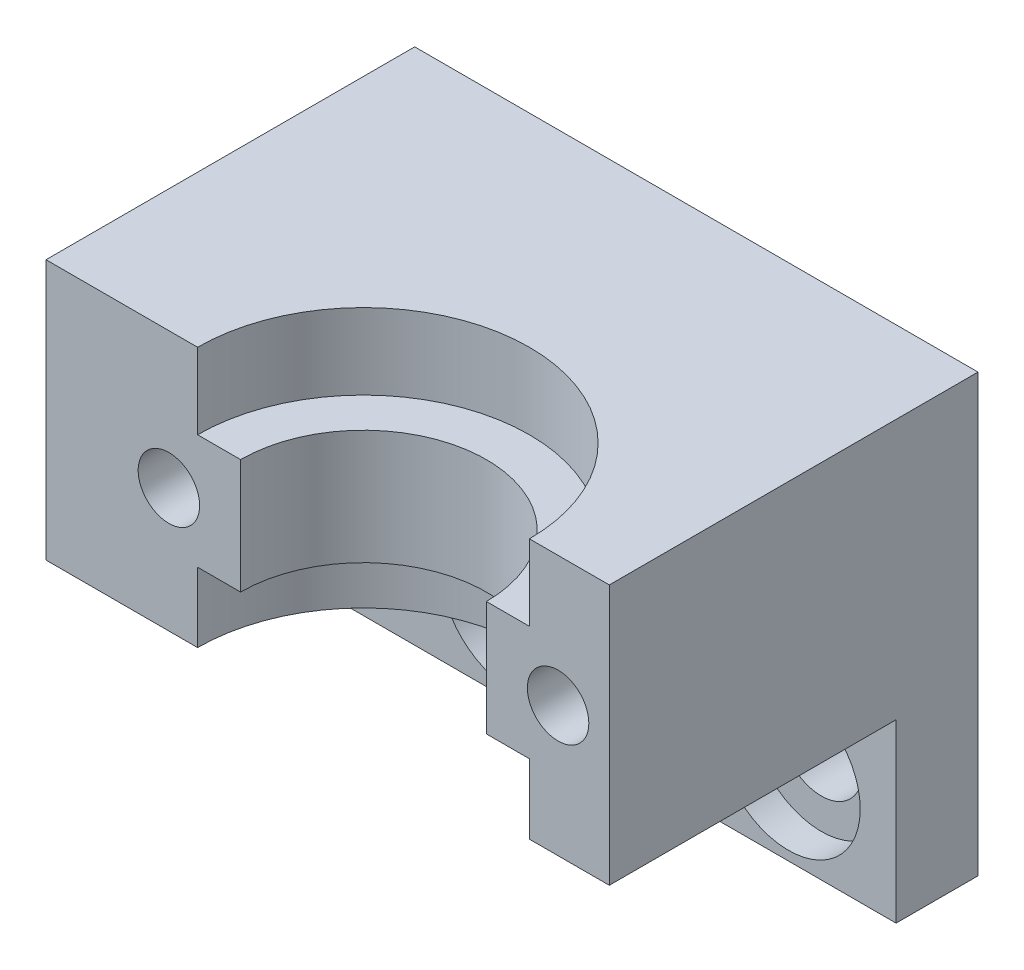
ISO-10303-21;
HEADER;
FILE_DESCRIPTION(('STEP AP214'),'2;1');
FILE_NAME('part.step','',(''),(''),'','','');
FILE_SCHEMA(('AUTOMOTIVE_DESIGN { 1 0 10303 214 1 1 1 1 }'));
ENDSEC;
DATA;
#1=APPLICATION_CONTEXT('core data for automotive mechanical design processes');
#2=APPLICATION_PROTOCOL_DEFINITION('international standard','automotive_design',2000,#1);
#3=PRODUCT_CONTEXT('',#1,'mechanical');
#4=PRODUCT('Part','Part','',(#3));
#5=PRODUCT_RELATED_PRODUCT_CATEGORY('part','',(#4));
#6=PRODUCT_DEFINITION_FORMATION('','',#4);
#7=PRODUCT_DEFINITION_CONTEXT('part definition',#1,'design');
#8=PRODUCT_DEFINITION('design','',#6,#7);
#9=PRODUCT_DEFINITION_SHAPE('','',#8);
#10=(LENGTH_UNIT() NAMED_UNIT(*) SI_UNIT(.MILLI.,.METRE.));
#11=(NAMED_UNIT(*) PLANE_ANGLE_UNIT() SI_UNIT($,.RADIAN.));
#12=(NAMED_UNIT(*) SI_UNIT($,.STERADIAN.) SOLID_ANGLE_UNIT());
#13=UNCERTAINTY_MEASURE_WITH_UNIT(LENGTH_MEASURE(1.E-05),#10,'distance_accuracy_value','');
#14=(GEOMETRIC_REPRESENTATION_CONTEXT(3) GLOBAL_UNCERTAINTY_ASSIGNED_CONTEXT((#13)) GLOBAL_UNIT_ASSIGNED_CONTEXT((#10,
#11,#12)) REPRESENTATION_CONTEXT('',''));
#15=CARTESIAN_POINT('',(0.,0.,0.));
#16=DIRECTION('',(0.,0.,1.));
#17=DIRECTION('',(1.,0.,0.));
#18=AXIS2_PLACEMENT_3D('',#15,#16,#17);
#19=CARTESIAN_POINT('',(-5.24999999999999,-4.65,-4.6));
#20=DIRECTION('',(0.,0.,1.));
#21=DIRECTION('',(1.,0.,0.));
#22=AXIS2_PLACEMENT_3D('',#19,#20,#21);
#23=CYLINDRICAL_SURFACE('',#22,2.);
#24=CARTESIAN_POINT('',(-5.24999999999999,-4.65,0.));
#25=DIRECTION('',(0.,0.,1.));
#26=DIRECTION('',(1.,0.,0.));
#27=AXIS2_PLACEMENT_3D('',#24,#25,#26);
#28=CIRCLE('',#27,2.);
#29=CARTESIAN_POINT('',(-3.24999999999999,-4.65,0.));
#30=VERTEX_POINT('',#29);
#31=EDGE_CURVE('E177',#30,#30,#28,.T.);
#32=CARTESIAN_POINT('',(-5.24999999999999,-4.65,2.4));
#33=DIRECTION('',(0.,0.,1.));
#34=DIRECTION('',(1.,0.,0.));
#35=AXIS2_PLACEMENT_3D('',#32,#33,#34);
#36=CIRCLE('',#35,2.);
#37=CARTESIAN_POINT('',(-3.24999999999999,-4.65,2.4));
#38=VERTEX_POINT('',#37);
#39=EDGE_CURVE('E37',#38,#38,#36,.F.);
#40=CARTESIAN_POINT('',(-3.24999999999999,-4.65,0.));
#41=CARTESIAN_POINT('',(-3.24999999999999,-4.65,0.0249999999999993));
#42=CARTESIAN_POINT('',(-3.24999999999999,-4.65,0.0499999999999994));
#43=CARTESIAN_POINT('',(-3.24999999999999,-4.65,0.0999999999999994));
#44=CARTESIAN_POINT('',(-3.24999999999999,-4.65,0.124999999999999));
#45=CARTESIAN_POINT('',(-3.24999999999999,-4.65,0.174999999999999));
#46=CARTESIAN_POINT('',(-3.24999999999999,-4.65,0.199999999999999));
#47=CARTESIAN_POINT('',(-3.24999999999999,-4.65,0.25));
#48=CARTESIAN_POINT('',(-3.24999999999999,-4.65,0.275));
#49=CARTESIAN_POINT('',(-3.24999999999999,-4.65,0.325));
#50=CARTESIAN_POINT('',(-3.24999999999999,-4.65,0.35));
#51=CARTESIAN_POINT('',(-3.24999999999999,-4.65,0.4));
#52=CARTESIAN_POINT('',(-3.24999999999999,-4.65,0.425));
#53=CARTESIAN_POINT('',(-3.24999999999999,-4.65,0.475));
#54=CARTESIAN_POINT('',(-3.24999999999999,-4.65,0.5));
#55=CARTESIAN_POINT('',(-3.24999999999999,-4.65,0.55));
#56=CARTESIAN_POINT('',(-3.24999999999999,-4.65,0.575000000000001));
#57=CARTESIAN_POINT('',(-3.24999999999999,-4.65,0.625000000000001));
#58=CARTESIAN_POINT('',(-3.24999999999999,-4.65,0.65));
#59=CARTESIAN_POINT('',(-3.24999999999999,-4.65,0.7));
#60=CARTESIAN_POINT('',(-3.24999999999999,-4.65,0.725000000000001));
#61=CARTESIAN_POINT('',(-3.24999999999999,-4.65,0.775));
#62=CARTESIAN_POINT('',(-3.24999999999999,-4.65,0.8));
#63=CARTESIAN_POINT('',(-3.24999999999999,-4.65,0.85));
#64=CARTESIAN_POINT('',(-3.24999999999999,-4.65,0.875));
#65=CARTESIAN_POINT('',(-3.24999999999999,-4.65,0.925000000000001));
#66=CARTESIAN_POINT('',(-3.24999999999999,-4.65,0.950000000000001));
#67=CARTESIAN_POINT('',(-3.24999999999999,-4.65,1.));
#68=CARTESIAN_POINT('',(-3.24999999999999,-4.65,1.025));
#69=CARTESIAN_POINT('',(-3.24999999999999,-4.65,1.075));
#70=CARTESIAN_POINT('',(-3.24999999999999,-4.65,1.1));
#71=CARTESIAN_POINT('',(-3.24999999999999,-4.65,1.15));
#72=CARTESIAN_POINT('',(-3.24999999999999,-4.65,1.175));
#73=CARTESIAN_POINT('',(-3.24999999999999,-4.65,1.225));
#74=CARTESIAN_POINT('',(-3.24999999999999,-4.65,1.25));
#75=CARTESIAN_POINT('',(-3.24999999999999,-4.65,1.3));
#76=CARTESIAN_POINT('',(-3.24999999999999,-4.65,1.325));
#77=CARTESIAN_POINT('',(-3.24999999999999,-4.65,1.375));
#78=CARTESIAN_POINT('',(-3.24999999999999,-4.65,1.4));
#79=CARTESIAN_POINT('',(-3.24999999999999,-4.65,1.45));
#80=CARTESIAN_POINT('',(-3.24999999999999,-4.65,1.475));
#81=CARTESIAN_POINT('',(-3.24999999999999,-4.65,1.525));
#82=CARTESIAN_POINT('',(-3.24999999999999,-4.65,1.55));
#83=CARTESIAN_POINT('',(-3.24999999999999,-4.65,1.6));
#84=CARTESIAN_POINT('',(-3.24999999999999,-4.65,1.625));
#85=CARTESIAN_POINT('',(-3.24999999999999,-4.65,1.675));
#86=CARTESIAN_POINT('',(-3.24999999999999,-4.65,1.7));
#87=CARTESIAN_POINT('',(-3.24999999999999,-4.65,1.75));
#88=CARTESIAN_POINT('',(-3.24999999999999,-4.65,1.775));
#89=CARTESIAN_POINT('',(-3.24999999999999,-4.65,1.825));
#90=CARTESIAN_POINT('',(-3.24999999999999,-4.65,1.85));
#91=CARTESIAN_POINT('',(-3.24999999999999,-4.65,1.9));
#92=CARTESIAN_POINT('',(-3.24999999999999,-4.65,1.925));
#93=CARTESIAN_POINT('',(-3.24999999999999,-4.65,1.975));
#94=CARTESIAN_POINT('',(-3.24999999999999,-4.65,2.));
#95=CARTESIAN_POINT('',(-3.24999999999999,-4.65,2.05));
#96=CARTESIAN_POINT('',(-3.24999999999999,-4.65,2.075));
#97=CARTESIAN_POINT('',(-3.24999999999999,-4.65,2.125));
#98=CARTESIAN_POINT('',(-3.24999999999999,-4.65,2.15));
#99=CARTESIAN_POINT('',(-3.24999999999999,-4.65,2.2));
#100=CARTESIAN_POINT('',(-3.24999999999999,-4.65,2.225));
#101=CARTESIAN_POINT('',(-3.24999999999999,-4.65,2.275));
#102=CARTESIAN_POINT('',(-3.24999999999999,-4.65,2.3));
#103=CARTESIAN_POINT('',(-3.24999999999999,-4.65,2.35));
#104=CARTESIAN_POINT('',(-3.24999999999999,-4.65,2.375));
#105=CARTESIAN_POINT('',(-3.24999999999999,-4.65,2.4));
#106=B_SPLINE_CURVE_WITH_KNOTS('',3,(#40,#41,#42,#43,#44,#45,#46,#47,#48,#49,#50,#51,#52,#53,
#54,#55,#56,#57,#58,#59,#60,#61,#62,#63,#64,#65,#66,#67,#68,#69,#70,#71,#72,#73,#74,#75,#76,#77,
#78,#79,#80,#81,#82,#83,#84,#85,#86,#87,#88,#89,#90,#91,#92,#93,#94,#95,#96,#97,#98,#99,#100,
#101,#102,#103,#104,#105),.UNSPECIFIED.,.F.,.F.,(4,2,2,2,2,2,2,2,2,2,2,2,2,2,2,2,2,2,2,2,2,2,2,
2,2,2,2,2,2,2,2,2,4),(0.,0.0750000000000004,0.15,0.225,0.300000000000001,0.375,
0.450000000000001,0.525000000000001,0.600000000000002,0.675000000000001,0.750000000000002,
0.825000000000001,0.900000000000001,0.975000000000002,1.05,1.125,1.2,1.275,1.35,1.425,1.5,1.575,
1.65,1.725,1.8,1.875,1.95,2.025,2.1,2.175,2.25,2.325,2.4),.UNSPECIFIED.);
#107=EDGE_CURVE('BSEAM33',#30,#38,#106,.T.);
#108=ORIENTED_EDGE('',*,*,#31,.F.);
#109=ORIENTED_EDGE('',*,*,#39,.F.);
#110=ORIENTED_EDGE('',*,*,#107,.T.);
#111=ORIENTED_EDGE('',*,*,#107,.F.);
#112=EDGE_LOOP('',(#108,#110,#109,#111));
#113=FACE_BOUND('',#112,.T.);
#114=ADVANCED_FACE('F33',(#113),#23,.F.);
#115=CARTESIAN_POINT('',(-18.75,-4.65,-4.6));
#116=DIRECTION('',(0.,0.,1.));
#117=DIRECTION('',(1.,0.,0.));
#118=AXIS2_PLACEMENT_3D('',#115,#116,#117);
#119=CYLINDRICAL_SURFACE('',#118,2.);
#120=CARTESIAN_POINT('',(-18.75,-4.65,0.));
#121=DIRECTION('',(0.,0.,1.));
#122=DIRECTION('',(1.,0.,0.));
#123=AXIS2_PLACEMENT_3D('',#120,#121,#122);
#124=CIRCLE('',#123,2.);
#125=CARTESIAN_POINT('',(-16.75,-4.65,0.));
#126=VERTEX_POINT('',#125);
#127=EDGE_CURVE('E180',#126,#126,#124,.T.);
#128=CARTESIAN_POINT('',(-18.75,-4.65,2.4));
#129=DIRECTION('',(0.,0.,1.));
#130=DIRECTION('',(1.,0.,0.));
#131=AXIS2_PLACEMENT_3D('',#128,#129,#130);
#132=CIRCLE('',#131,2.);
#133=CARTESIAN_POINT('',(-16.75,-4.65,2.4));
#134=VERTEX_POINT('',#133);
#135=EDGE_CURVE('E168',#134,#134,#132,.F.);
#136=CARTESIAN_POINT('',(-16.75,-4.65,0.));
#137=CARTESIAN_POINT('',(-16.75,-4.65,0.0249999999999993));
#138=CARTESIAN_POINT('',(-16.75,-4.65,0.0499999999999994));
#139=CARTESIAN_POINT('',(-16.75,-4.65,0.0999999999999994));
#140=CARTESIAN_POINT('',(-16.75,-4.65,0.124999999999999));
#141=CARTESIAN_POINT('',(-16.75,-4.65,0.174999999999999));
#142=CARTESIAN_POINT('',(-16.75,-4.65,0.199999999999999));
#143=CARTESIAN_POINT('',(-16.75,-4.65,0.25));
#144=CARTESIAN_POINT('',(-16.75,-4.65,0.275));
#145=CARTESIAN_POINT('',(-16.75,-4.65,0.325));
#146=CARTESIAN_POINT('',(-16.75,-4.65,0.35));
#147=CARTESIAN_POINT('',(-16.75,-4.65,0.4));
#148=CARTESIAN_POINT('',(-16.75,-4.65,0.425));
#149=CARTESIAN_POINT('',(-16.75,-4.65,0.475));
#150=CARTESIAN_POINT('',(-16.75,-4.65,0.5));
#151=CARTESIAN_POINT('',(-16.75,-4.65,0.55));
#152=CARTESIAN_POINT('',(-16.75,-4.65,0.575000000000001));
#153=CARTESIAN_POINT('',(-16.75,-4.65,0.625000000000001));
#154=CARTESIAN_POINT('',(-16.75,-4.65,0.65));
#155=CARTESIAN_POINT('',(-16.75,-4.65,0.7));
#156=CARTESIAN_POINT('',(-16.75,-4.65,0.725000000000001));
#157=CARTESIAN_POINT('',(-16.75,-4.65,0.775));
#158=CARTESIAN_POINT('',(-16.75,-4.65,0.8));
#159=CARTESIAN_POINT('',(-16.75,-4.65,0.85));
#160=CARTESIAN_POINT('',(-16.75,-4.65,0.875));
#161=CARTESIAN_POINT('',(-16.75,-4.65,0.925000000000001));
#162=CARTESIAN_POINT('',(-16.75,-4.65,0.950000000000001));
#163=CARTESIAN_POINT('',(-16.75,-4.65,1.));
#164=CARTESIAN_POINT('',(-16.75,-4.65,1.025));
#165=CARTESIAN_POINT('',(-16.75,-4.65,1.075));
#166=CARTESIAN_POINT('',(-16.75,-4.65,1.1));
#167=CARTESIAN_POINT('',(-16.75,-4.65,1.15));
#168=CARTESIAN_POINT('',(-16.75,-4.65,1.175));
#169=CARTESIAN_POINT('',(-16.75,-4.65,1.225));
#170=CARTESIAN_POINT('',(-16.75,-4.65,1.25));
#171=CARTESIAN_POINT('',(-16.75,-4.65,1.3));
#172=CARTESIAN_POINT('',(-16.75,-4.65,1.325));
#173=CARTESIAN_POINT('',(-16.75,-4.65,1.375));
#174=CARTESIAN_POINT('',(-16.75,-4.65,1.4));
#175=CARTESIAN_POINT('',(-16.75,-4.65,1.45));
#176=CARTESIAN_POINT('',(-16.75,-4.65,1.475));
#177=CARTESIAN_POINT('',(-16.75,-4.65,1.525));
#178=CARTESIAN_POINT('',(-16.75,-4.65,1.55));
#179=CARTESIAN_POINT('',(-16.75,-4.65,1.6));
#180=CARTESIAN_POINT('',(-16.75,-4.65,1.625));
#181=CARTESIAN_POINT('',(-16.75,-4.65,1.675));
#182=CARTESIAN_POINT('',(-16.75,-4.65,1.7));
#183=CARTESIAN_POINT('',(-16.75,-4.65,1.75));
#184=CARTESIAN_POINT('',(-16.75,-4.65,1.775));
#185=CARTESIAN_POINT('',(-16.75,-4.65,1.825));
#186=CARTESIAN_POINT('',(-16.75,-4.65,1.85));
#187=CARTESIAN_POINT('',(-16.75,-4.65,1.9));
#188=CARTESIAN_POINT('',(-16.75,-4.65,1.925));
#189=CARTESIAN_POINT('',(-16.75,-4.65,1.975));
#190=CARTESIAN_POINT('',(-16.75,-4.65,2.));
#191=CARTESIAN_POINT('',(-16.75,-4.65,2.05));
#192=CARTESIAN_POINT('',(-16.75,-4.65,2.075));
#193=CARTESIAN_POINT('',(-16.75,-4.65,2.125));
#194=CARTESIAN_POINT('',(-16.75,-4.65,2.15));
#195=CARTESIAN_POINT('',(-16.75,-4.65,2.2));
#196=CARTESIAN_POINT('',(-16.75,-4.65,2.225));
#197=CARTESIAN_POINT('',(-16.75,-4.65,2.275));
#198=CARTESIAN_POINT('',(-16.75,-4.65,2.3));
#199=CARTESIAN_POINT('',(-16.75,-4.65,2.35));
#200=CARTESIAN_POINT('',(-16.75,-4.65,2.375));
#201=CARTESIAN_POINT('',(-16.75,-4.65,2.4));
#202=B_SPLINE_CURVE_WITH_KNOTS('',3,(#136,#137,#138,#139,#140,#141,#142,#143,#144,#145,#146,
#147,#148,#149,#150,#151,#152,#153,#154,#155,#156,#157,#158,#159,#160,#161,#162,#163,#164,#165,
#166,#167,#168,#169,#170,#171,#172,#173,#174,#175,#176,#177,#178,#179,#180,#181,#182,#183,#184,
#185,#186,#187,#188,#189,#190,#191,#192,#193,#194,#195,#196,#197,#198,#199,#200,#201),
.UNSPECIFIED.,.F.,.F.,(4,2,2,2,2,2,2,2,2,2,2,2,2,2,2,2,2,2,2,2,2,2,2,2,2,2,2,2,2,2,2,2,4),(0.,
0.0750000000000004,0.15,0.225,0.300000000000001,0.375,0.450000000000001,0.525000000000001,
0.600000000000002,0.675000000000001,0.750000000000002,0.825000000000001,0.900000000000001,
0.975000000000002,1.05,1.125,1.2,1.275,1.35,1.425,1.5,1.575,1.65,1.725,1.8,1.875,1.95,2.025,2.1,
2.175,2.25,2.325,2.4),.UNSPECIFIED.);
#203=EDGE_CURVE('BSEAM261',#126,#134,#202,.T.);
#204=ORIENTED_EDGE('',*,*,#127,.F.);
#205=ORIENTED_EDGE('',*,*,#135,.F.);
#206=ORIENTED_EDGE('',*,*,#203,.T.);
#207=ORIENTED_EDGE('',*,*,#203,.F.);
#208=EDGE_LOOP('',(#204,#206,#205,#207));
#209=FACE_BOUND('',#208,.T.);
#210=ADVANCED_FACE('F261',(#209),#119,.F.);
#211=CARTESIAN_POINT('',(0.,0.,18.));
#212=DIRECTION('',(0.,1.,0.));
#213=DIRECTION('',(-1.,0.,0.));
#214=AXIS2_PLACEMENT_3D('',#211,#212,#213);
#215=PLANE('',#214);
#216=DIRECTION('',(-1.,0.,0.));
#217=VECTOR('',#216,1.);
#218=CARTESIAN_POINT('',(-24.,0.,4.));
#219=LINE('',#218,#217);
#220=CARTESIAN_POINT('',(0.,0.,4.));
#221=VERTEX_POINT('',#220);
#222=CARTESIAN_POINT('',(-27.5,0.,4.));
#223=VERTEX_POINT('',#222);
#224=EDGE_CURVE('E50',#221,#223,#219,.T.);
#225=ORIENTED_EDGE('',*,*,#224,.F.);
#226=DIRECTION('',(0.,0.,-1.));
#227=VECTOR('',#226,1.);
#228=CARTESIAN_POINT('',(0.,0.,18.));
#229=LINE('',#228,#227);
#230=CARTESIAN_POINT('',(0.,0.,18.));
#231=VERTEX_POINT('',#230);
#232=EDGE_CURVE('E245',#231,#221,#229,.T.);
#233=ORIENTED_EDGE('',*,*,#232,.F.);
#234=DIRECTION('',(1.,0.,0.));
#235=VECTOR('',#234,1.);
#236=CARTESIAN_POINT('',(0.,0.,18.));
#237=LINE('',#236,#235);
#238=CARTESIAN_POINT('',(-3.89999999999999,0.,18.));
#239=VERTEX_POINT('',#238);
#240=EDGE_CURVE('E241',#239,#231,#237,.T.);
#241=ORIENTED_EDGE('',*,*,#240,.F.);
#242=CARTESIAN_POINT('',(-12.,0.,18.));
#243=DIRECTION('',(0.,1.,0.));
#244=DIRECTION('',(-1.,0.,0.));
#245=AXIS2_PLACEMENT_3D('',#242,#243,#244);
#246=CIRCLE('',#245,8.1);
#247=CARTESIAN_POINT('',(-20.1,0.,18.));
#248=VERTEX_POINT('',#247);
#249=EDGE_CURVE('E42',#239,#248,#246,.T.);
#250=ORIENTED_EDGE('',*,*,#249,.T.);
#251=CARTESIAN_POINT('',(-27.5,0.,18.));
#252=VERTEX_POINT('',#251);
#253=EDGE_CURVE('E242',#252,#248,#237,.T.);
#254=ORIENTED_EDGE('',*,*,#253,.F.);
#255=DIRECTION('',(0.,0.,1.));
#256=VECTOR('',#255,1.);
#257=CARTESIAN_POINT('',(-27.5,0.,4.));
#258=LINE('',#257,#256);
#259=EDGE_CURVE('E161',#223,#252,#258,.T.);
#260=ORIENTED_EDGE('',*,*,#259,.F.);
#261=EDGE_LOOP('',(#225,#233,#241,#250,#254,#260));
#262=FACE_BOUND('',#261,.T.);
#263=ADVANCED_FACE('F267',(#262),#215,.F.);
#264=CARTESIAN_POINT('',(-12.,-2.30000000000001,18.));
#265=DIRECTION('',(0.,1.,0.));
#266=DIRECTION('',(-1.,0.,0.));
#267=AXIS2_PLACEMENT_3D('',#264,#265,#266);
#268=CYLINDRICAL_SURFACE('',#267,6.);
#269=CARTESIAN_POINT('',(-12.,3.4,18.));
#270=DIRECTION('',(0.,-1.,0.));
#271=DIRECTION('',(1.,0.,0.));
#272=AXIS2_PLACEMENT_3D('',#269,#270,#271);
#273=CIRCLE('',#272,6.);
#274=CARTESIAN_POINT('',(-6.,3.4,18.));
#275=VERTEX_POINT('',#274);
#276=CARTESIAN_POINT('',(-18.,3.4,18.));
#277=VERTEX_POINT('',#276);
#278=EDGE_CURVE('E198',#275,#277,#273,.F.);
#279=ORIENTED_EDGE('',*,*,#278,.F.);
#280=DIRECTION('',(0.,1.,0.));
#281=VECTOR('',#280,1.);
#282=CARTESIAN_POINT('',(-6.,-2.30000000000001,18.));
#283=LINE('',#282,#281);
#284=CARTESIAN_POINT('',(-6.,9.,18.));
#285=VERTEX_POINT('',#284);
#286=EDGE_CURVE('E221',#275,#285,#283,.T.);
#287=ORIENTED_EDGE('',*,*,#286,.T.);
#288=CARTESIAN_POINT('',(-12.,9.,18.));
#289=DIRECTION('',(0.,1.,0.));
#290=DIRECTION('',(-1.,0.,0.));
#291=AXIS2_PLACEMENT_3D('',#288,#289,#290);
#292=CIRCLE('',#291,6.);
#293=CARTESIAN_POINT('',(-18.,9.,18.));
#294=VERTEX_POINT('',#293);
#295=EDGE_CURVE('E249',#294,#285,#292,.F.);
#296=ORIENTED_EDGE('',*,*,#295,.F.);
#297=DIRECTION('',(0.,1.,0.));
#298=VECTOR('',#297,1.);
#299=CARTESIAN_POINT('',(-18.,-2.30000000000001,18.));
#300=LINE('',#299,#298);
#301=EDGE_CURVE('E218',#294,#277,#300,.F.);
#302=ORIENTED_EDGE('',*,*,#301,.T.);
#303=EDGE_LOOP('',(#279,#287,#296,#302));
#304=FACE_BOUND('',#303,.T.);
#305=ADVANCED_FACE('F298',(#304),#268,.F.);
#306=CARTESIAN_POINT('',(0.,0.,18.));
#307=DIRECTION('',(0.,0.,1.));
#308=DIRECTION('',(1.,0.,0.));
#309=AXIS2_PLACEMENT_3D('',#306,#307,#308);
#310=PLANE('',#309);
#311=DIRECTION('',(0.,-1.,0.));
#312=VECTOR('',#311,1.);
#313=CARTESIAN_POINT('',(-3.89999999999999,3.4,18.));
#314=LINE('',#313,#312);
#315=CARTESIAN_POINT('',(-3.89999999999999,3.4,18.));
#316=VERTEX_POINT('',#315);
#317=EDGE_CURVE('E196',#239,#316,#314,.F.);
#318=ORIENTED_EDGE('',*,*,#317,.F.);
#319=ORIENTED_EDGE('',*,*,#240,.T.);
#320=DIRECTION('',(0.,1.,0.));
#321=VECTOR('',#320,1.);
#322=CARTESIAN_POINT('',(0.,0.,18.));
#323=LINE('',#322,#321);
#324=CARTESIAN_POINT('',(0.,12.7,18.));
#325=VERTEX_POINT('',#324);
#326=EDGE_CURVE('E136',#231,#325,#323,.T.);
#327=ORIENTED_EDGE('',*,*,#326,.T.);
#328=DIRECTION('',(-1.,0.,0.));
#329=VECTOR('',#328,1.);
#330=CARTESIAN_POINT('',(0.,12.7,18.));
#331=LINE('',#330,#329);
#332=CARTESIAN_POINT('',(-3.89999999999999,12.7,18.));
#333=VERTEX_POINT('',#332);
#334=EDGE_CURVE('E238',#325,#333,#331,.T.);
#335=ORIENTED_EDGE('',*,*,#334,.T.);
#336=DIRECTION('',(0.,1.,0.));
#337=VECTOR('',#336,1.);
#338=CARTESIAN_POINT('',(-3.89999999999999,9.,18.));
#339=LINE('',#338,#337);
#340=CARTESIAN_POINT('',(-3.89999999999999,9.,18.));
#341=VERTEX_POINT('',#340);
#342=EDGE_CURVE('E216',#341,#333,#339,.T.);
#343=ORIENTED_EDGE('',*,*,#342,.F.);
#344=DIRECTION('',(-1.,0.,0.));
#345=VECTOR('',#344,1.);
#346=CARTESIAN_POINT('',(0.,9.,18.));
#347=LINE('',#346,#345);
#348=EDGE_CURVE('E211',#341,#285,#347,.T.);
#349=ORIENTED_EDGE('',*,*,#348,.T.);
#350=ORIENTED_EDGE('',*,*,#286,.F.);
#351=DIRECTION('',(1.,0.,0.));
#352=VECTOR('',#351,1.);
#353=CARTESIAN_POINT('',(0.,3.4,18.));
#354=LINE('',#353,#352);
#355=EDGE_CURVE('E200',#275,#316,#354,.T.);
#356=ORIENTED_EDGE('',*,*,#355,.T.);
#357=EDGE_LOOP('',(#318,#319,#327,#335,#343,#349,#350,#356));
#358=FACE_BOUND('',#357,.T.);
#359=CARTESIAN_POINT('',(-2.5,6.35,18.));
#360=DIRECTION('',(0.,0.,1.));
#361=DIRECTION('',(1.,0.,0.));
#362=AXIS2_PLACEMENT_3D('',#359,#360,#361);
#363=CIRCLE('',#362,1.5);
#364=CARTESIAN_POINT('',(-0.999999999999995,6.35,18.));
#365=VERTEX_POINT('',#364);
#366=EDGE_CURVE('E224',#365,#365,#363,.T.);
#367=ORIENTED_EDGE('',*,*,#366,.F.);
#368=EDGE_LOOP('',(#367));
#369=FACE_BOUND('',#368,.T.);
#370=ADVANCED_FACE('F301',(#358,#369),#310,.T.);
#371=DIRECTION('',(0.,-1.,0.));
#372=VECTOR('',#371,1.);
#373=CARTESIAN_POINT('',(-20.1,3.4,18.));
#374=LINE('',#373,#372);
#375=CARTESIAN_POINT('',(-20.1,3.4,18.));
#376=VERTEX_POINT('',#375);
#377=EDGE_CURVE('E58',#376,#248,#374,.T.);
#378=ORIENTED_EDGE('',*,*,#377,.F.);
#379=DIRECTION('',(1.,0.,0.));
#380=VECTOR('',#379,1.);
#381=CARTESIAN_POINT('',(0.,3.4,18.));
#382=LINE('',#381,#380);
#383=EDGE_CURVE('E11',#376,#277,#382,.T.);
#384=ORIENTED_EDGE('',*,*,#383,.T.);
#385=ORIENTED_EDGE('',*,*,#301,.F.);
#386=DIRECTION('',(-1.,0.,0.));
#387=VECTOR('',#386,1.);
#388=CARTESIAN_POINT('',(0.,9.,18.));
#389=LINE('',#388,#387);
#390=CARTESIAN_POINT('',(-20.1,9.,18.));
#391=VERTEX_POINT('',#390);
#392=EDGE_CURVE('E207',#294,#391,#389,.T.);
#393=ORIENTED_EDGE('',*,*,#392,.T.);
#394=DIRECTION('',(0.,1.,0.));
#395=VECTOR('',#394,1.);
#396=CARTESIAN_POINT('',(-20.1,9.,18.));
#397=LINE('',#396,#395);
#398=CARTESIAN_POINT('',(-20.1,12.7,18.));
#399=VERTEX_POINT('',#398);
#400=EDGE_CURVE('E214',#399,#391,#397,.F.);
#401=ORIENTED_EDGE('',*,*,#400,.F.);
#402=CARTESIAN_POINT('',(-27.5,12.7,18.));
#403=VERTEX_POINT('',#402);
#404=EDGE_CURVE('E237',#399,#403,#331,.T.);
#405=ORIENTED_EDGE('',*,*,#404,.T.);
#406=DIRECTION('',(0.,1.,0.));
#407=VECTOR('',#406,1.);
#408=CARTESIAN_POINT('',(-27.5,0.,18.));
#409=LINE('',#408,#407);
#410=EDGE_CURVE('E154',#252,#403,#409,.T.);
#411=ORIENTED_EDGE('',*,*,#410,.F.);
#412=ORIENTED_EDGE('',*,*,#253,.T.);
#413=EDGE_LOOP('',(#378,#384,#385,#393,#401,#405,#411,#412));
#414=FACE_BOUND('',#413,.T.);
#415=CARTESIAN_POINT('',(-21.5,6.05,18.));
#416=DIRECTION('',(0.,0.,1.));
#417=DIRECTION('',(1.,0.,0.));
#418=AXIS2_PLACEMENT_3D('',#415,#416,#417);
#419=CIRCLE('',#418,1.5);
#420=CARTESIAN_POINT('',(-20.,6.05,18.));
#421=VERTEX_POINT('',#420);
#422=EDGE_CURVE('E230',#421,#421,#419,.T.);
#423=ORIENTED_EDGE('',*,*,#422,.F.);
#424=EDGE_LOOP('',(#423));
#425=FACE_BOUND('',#424,.T.);
#426=ADVANCED_FACE('F310',(#414,#425),#310,.T.);
#427=CARTESIAN_POINT('',(0.,0.,0.));
#428=DIRECTION('',(0.,0.,1.));
#429=DIRECTION('',(1.,0.,0.));
#430=AXIS2_PLACEMENT_3D('',#427,#428,#429);
#431=PLANE('',#430);
#432=ORIENTED_EDGE('',*,*,#127,.T.);
#433=EDGE_LOOP('',(#432));
#434=FACE_BOUND('',#433,.T.);
#435=ORIENTED_EDGE('',*,*,#31,.T.);
#436=EDGE_LOOP('',(#435));
#437=FACE_BOUND('',#436,.T.);
#438=DIRECTION('',(0.,1.,0.));
#439=VECTOR('',#438,1.);
#440=CARTESIAN_POINT('',(0.,0.,0.));
#441=LINE('',#440,#439);
#442=CARTESIAN_POINT('',(0.,-8.6,0.));
#443=VERTEX_POINT('',#442);
#444=CARTESIAN_POINT('',(0.,12.7,0.));
#445=VERTEX_POINT('',#444);
#446=EDGE_CURVE('E137',#443,#445,#441,.T.);
#447=ORIENTED_EDGE('',*,*,#446,.F.);
#448=DIRECTION('',(1.,0.,0.));
#449=VECTOR('',#448,1.);
#450=CARTESIAN_POINT('',(0.,-8.6,0.));
#451=LINE('',#450,#449);
#452=CARTESIAN_POINT('',(-27.5,-8.6,0.));
#453=VERTEX_POINT('',#452);
#454=EDGE_CURVE('E144',#453,#443,#451,.T.);
#455=ORIENTED_EDGE('',*,*,#454,.F.);
#456=DIRECTION('',(0.,-1.,0.));
#457=VECTOR('',#456,1.);
#458=CARTESIAN_POINT('',(-27.5,12.7,0.));
#459=LINE('',#458,#457);
#460=CARTESIAN_POINT('',(-27.5,12.7,0.));
#461=VERTEX_POINT('',#460);
#462=EDGE_CURVE('E140',#461,#453,#459,.T.);
#463=ORIENTED_EDGE('',*,*,#462,.F.);
#464=DIRECTION('',(-1.,0.,0.));
#465=VECTOR('',#464,1.);
#466=CARTESIAN_POINT('',(0.,12.7,0.));
#467=LINE('',#466,#465);
#468=EDGE_CURVE('E126',#445,#461,#467,.T.);
#469=ORIENTED_EDGE('',*,*,#468,.F.);
#470=EDGE_LOOP('',(#447,#455,#463,#469));
#471=FACE_BOUND('',#470,.T.);
#472=CARTESIAN_POINT('',(-21.5,6.05,0.));
#473=DIRECTION('',(0.,0.,1.));
#474=DIRECTION('',(1.,0.,0.));
#475=AXIS2_PLACEMENT_3D('',#472,#473,#474);
#476=CIRCLE('',#475,1.5);
#477=CARTESIAN_POINT('',(-20.,6.05,0.));
#478=VERTEX_POINT('',#477);
#479=EDGE_CURVE('E227',#478,#478,#476,.T.);
#480=ORIENTED_EDGE('',*,*,#479,.T.);
#481=EDGE_LOOP('',(#480));
#482=FACE_BOUND('',#481,.T.);
#483=CARTESIAN_POINT('',(-2.5,6.35,0.));
#484=DIRECTION('',(0.,0.,1.));
#485=DIRECTION('',(1.,0.,0.));
#486=AXIS2_PLACEMENT_3D('',#483,#484,#485);
#487=CIRCLE('',#486,1.5);
#488=CARTESIAN_POINT('',(-0.999999999999995,6.35,0.));
#489=VERTEX_POINT('',#488);
#490=EDGE_CURVE('E223',#489,#489,#487,.T.);
#491=ORIENTED_EDGE('',*,*,#490,.T.);
#492=EDGE_LOOP('',(#491));
#493=FACE_BOUND('',#492,.T.);
#494=ADVANCED_FACE('F141',(#434,#437,#471,#482,#493),#431,.F.);
#495=CARTESIAN_POINT('',(0.,0.,18.));
#496=DIRECTION('',(-1.,0.,0.));
#497=DIRECTION('',(0.,-1.,0.));
#498=AXIS2_PLACEMENT_3D('',#495,#496,#497);
#499=PLANE('',#498);
#500=ORIENTED_EDGE('',*,*,#446,.T.);
#501=DIRECTION('',(0.,0.,-1.));
#502=VECTOR('',#501,1.);
#503=CARTESIAN_POINT('',(0.,12.7,18.));
#504=LINE('',#503,#502);
#505=EDGE_CURVE('E133',#325,#445,#504,.T.);
#506=ORIENTED_EDGE('',*,*,#505,.F.);
#507=ORIENTED_EDGE('',*,*,#326,.F.);
#508=ORIENTED_EDGE('',*,*,#232,.T.);
#509=DIRECTION('',(0.,1.,0.));
#510=VECTOR('',#509,1.);
#511=CARTESIAN_POINT('',(0.,-8.6,4.));
#512=LINE('',#511,#510);
#513=CARTESIAN_POINT('',(0.,-8.6,4.));
#514=VERTEX_POINT('',#513);
#515=EDGE_CURVE('E188',#514,#221,#512,.T.);
#516=ORIENTED_EDGE('',*,*,#515,.F.);
#517=DIRECTION('',(0.,0.,1.));
#518=VECTOR('',#517,1.);
#519=CARTESIAN_POINT('',(0.,-8.6,4.));
#520=LINE('',#519,#518);
#521=EDGE_CURVE('E184',#443,#514,#520,.T.);
#522=ORIENTED_EDGE('',*,*,#521,.F.);
#523=EDGE_LOOP('',(#500,#506,#507,#508,#516,#522));
#524=FACE_BOUND('',#523,.T.);
#525=ADVANCED_FACE('F35',(#524),#499,.F.);
#526=CARTESIAN_POINT('',(0.,12.7,18.));
#527=DIRECTION('',(0.,-1.,0.));
#528=DIRECTION('',(1.,0.,0.));
#529=AXIS2_PLACEMENT_3D('',#526,#527,#528);
#530=PLANE('',#529);
#531=ORIENTED_EDGE('',*,*,#404,.F.);
#532=CARTESIAN_POINT('',(-12.,12.7,18.));
#533=DIRECTION('',(0.,1.,0.));
#534=DIRECTION('',(-1.,0.,0.));
#535=AXIS2_PLACEMENT_3D('',#532,#533,#534);
#536=CIRCLE('',#535,8.1);
#537=EDGE_CURVE('E203',#333,#399,#536,.T.);
#538=ORIENTED_EDGE('',*,*,#537,.F.);
#539=ORIENTED_EDGE('',*,*,#334,.F.);
#540=ORIENTED_EDGE('',*,*,#505,.T.);
#541=ORIENTED_EDGE('',*,*,#468,.T.);
#542=DIRECTION('',(0.,0.,-1.));
#543=VECTOR('',#542,1.);
#544=CARTESIAN_POINT('',(-27.5,12.7,18.));
#545=LINE('',#544,#543);
#546=EDGE_CURVE('E131',#403,#461,#545,.T.);
#547=ORIENTED_EDGE('',*,*,#546,.F.);
#548=EDGE_LOOP('',(#531,#538,#539,#540,#541,#547));
#549=FACE_BOUND('',#548,.T.);
#550=ADVANCED_FACE('F129',(#549),#530,.F.);
#551=CARTESIAN_POINT('',(-21.5,6.05,18.));
#552=DIRECTION('',(0.,0.,-1.));
#553=DIRECTION('',(-1.,0.,0.));
#554=AXIS2_PLACEMENT_3D('',#551,#552,#553);
#555=CYLINDRICAL_SURFACE('',#554,1.5);
#556=ORIENTED_EDGE('',*,*,#422,.T.);
#557=EDGE_LOOP('',(#556));
#558=FACE_BOUND('',#557,.T.);
#559=ORIENTED_EDGE('',*,*,#479,.F.);
#560=EDGE_LOOP('',(#559));
#561=FACE_BOUND('',#560,.T.);
#562=ADVANCED_FACE('F305',(#558,#561),#555,.F.);
#563=CARTESIAN_POINT('',(-2.5,6.35,18.));
#564=DIRECTION('',(0.,0.,-1.));
#565=DIRECTION('',(-1.,0.,0.));
#566=AXIS2_PLACEMENT_3D('',#563,#564,#565);
#567=CYLINDRICAL_SURFACE('',#566,1.5);
#568=ORIENTED_EDGE('',*,*,#366,.T.);
#569=EDGE_LOOP('',(#568));
#570=FACE_BOUND('',#569,.T.);
#571=ORIENTED_EDGE('',*,*,#490,.F.);
#572=EDGE_LOOP('',(#571));
#573=FACE_BOUND('',#572,.T.);
#574=ADVANCED_FACE('F296',(#570,#573),#567,.F.);
#575=CARTESIAN_POINT('',(-12.,9.,18.));
#576=DIRECTION('',(0.,1.,0.));
#577=DIRECTION('',(-1.,0.,0.));
#578=AXIS2_PLACEMENT_3D('',#575,#576,#577);
#579=CYLINDRICAL_SURFACE('',#578,8.1);
#580=ORIENTED_EDGE('',*,*,#342,.T.);
#581=ORIENTED_EDGE('',*,*,#537,.T.);
#582=ORIENTED_EDGE('',*,*,#400,.T.);
#583=CARTESIAN_POINT('',(-12.,9.,18.));
#584=DIRECTION('',(0.,1.,0.));
#585=DIRECTION('',(-1.,0.,0.));
#586=AXIS2_PLACEMENT_3D('',#583,#584,#585);
#587=CIRCLE('',#586,8.1);
#588=EDGE_CURVE('E204',#341,#391,#587,.T.);
#589=ORIENTED_EDGE('',*,*,#588,.F.);
#590=EDGE_LOOP('',(#580,#581,#582,#589));
#591=FACE_BOUND('',#590,.T.);
#592=ADVANCED_FACE('F292',(#591),#579,.F.);
#593=CARTESIAN_POINT('',(-12.,9.,18.));
#594=DIRECTION('',(0.,1.,0.));
#595=DIRECTION('',(-1.,0.,0.));
#596=AXIS2_PLACEMENT_3D('',#593,#594,#595);
#597=PLANE('',#596);
#598=ORIENTED_EDGE('',*,*,#588,.T.);
#599=ORIENTED_EDGE('',*,*,#392,.F.);
#600=ORIENTED_EDGE('',*,*,#295,.T.);
#601=ORIENTED_EDGE('',*,*,#348,.F.);
#602=EDGE_LOOP('',(#598,#599,#600,#601));
#603=FACE_BOUND('',#602,.T.);
#604=ADVANCED_FACE('F289',(#603),#597,.T.);
#605=CARTESIAN_POINT('',(-12.,3.4,18.));
#606=DIRECTION('',(0.,-1.,0.));
#607=DIRECTION('',(1.,0.,0.));
#608=AXIS2_PLACEMENT_3D('',#605,#606,#607);
#609=CYLINDRICAL_SURFACE('',#608,8.1);
#610=ORIENTED_EDGE('',*,*,#317,.T.);
#611=CARTESIAN_POINT('',(-12.,3.4,18.));
#612=DIRECTION('',(0.,-1.,0.));
#613=DIRECTION('',(1.,0.,0.));
#614=AXIS2_PLACEMENT_3D('',#611,#612,#613);
#615=CIRCLE('',#614,8.1);
#616=EDGE_CURVE('E192',#376,#316,#615,.T.);
#617=ORIENTED_EDGE('',*,*,#616,.F.);
#618=ORIENTED_EDGE('',*,*,#377,.T.);
#619=ORIENTED_EDGE('',*,*,#249,.F.);
#620=EDGE_LOOP('',(#610,#617,#618,#619));
#621=FACE_BOUND('',#620,.T.);
#622=ADVANCED_FACE('F285',(#621),#609,.F.);
#623=CARTESIAN_POINT('',(-12.,3.4,18.));
#624=DIRECTION('',(0.,-1.,0.));
#625=DIRECTION('',(1.,0.,0.));
#626=AXIS2_PLACEMENT_3D('',#623,#624,#625);
#627=PLANE('',#626);
#628=ORIENTED_EDGE('',*,*,#278,.T.);
#629=ORIENTED_EDGE('',*,*,#383,.F.);
#630=ORIENTED_EDGE('',*,*,#616,.T.);
#631=ORIENTED_EDGE('',*,*,#355,.F.);
#632=EDGE_LOOP('',(#628,#629,#630,#631));
#633=FACE_BOUND('',#632,.T.);
#634=ADVANCED_FACE('F281',(#633),#627,.T.);
#635=CARTESIAN_POINT('',(-24.,-8.6,4.));
#636=DIRECTION('',(0.,0.,-1.));
#637=DIRECTION('',(-1.,0.,0.));
#638=AXIS2_PLACEMENT_3D('',#635,#636,#637);
#639=PLANE('',#638);
#640=CARTESIAN_POINT('',(-18.75,-4.65,4.));
#641=DIRECTION('',(0.,0.,1.));
#642=DIRECTION('',(1.,0.,0.));
#643=AXIS2_PLACEMENT_3D('',#640,#641,#642);
#644=CIRCLE('',#643,3.5);
#645=CARTESIAN_POINT('',(-15.25,-4.65,4.));
#646=VERTEX_POINT('',#645);
#647=EDGE_CURVE('E169',#646,#646,#644,.T.);
#648=ORIENTED_EDGE('',*,*,#647,.F.);
#649=EDGE_LOOP('',(#648));
#650=FACE_BOUND('',#649,.T.);
#651=CARTESIAN_POINT('',(-5.24999999999999,-4.65,4.));
#652=DIRECTION('',(0.,0.,1.));
#653=DIRECTION('',(1.,0.,0.));
#654=AXIS2_PLACEMENT_3D('',#651,#652,#653);
#655=CIRCLE('',#654,3.5);
#656=CARTESIAN_POINT('',(-1.74999999999999,-4.65,4.));
#657=VERTEX_POINT('',#656);
#658=EDGE_CURVE('E164',#657,#657,#655,.T.);
#659=ORIENTED_EDGE('',*,*,#658,.F.);
#660=EDGE_LOOP('',(#659));
#661=FACE_BOUND('',#660,.T.);
#662=ORIENTED_EDGE('',*,*,#224,.T.);
#663=DIRECTION('',(0.,1.,0.));
#664=VECTOR('',#663,1.);
#665=CARTESIAN_POINT('',(-27.5,-8.6,4.));
#666=LINE('',#665,#664);
#667=CARTESIAN_POINT('',(-27.5,-8.6,4.));
#668=VERTEX_POINT('',#667);
#669=EDGE_CURVE('E158',#668,#223,#666,.T.);
#670=ORIENTED_EDGE('',*,*,#669,.F.);
#671=DIRECTION('',(-1.,0.,0.));
#672=VECTOR('',#671,1.);
#673=CARTESIAN_POINT('',(-24.,-8.6,4.));
#674=LINE('',#673,#672);
#675=EDGE_CURVE('E186',#514,#668,#674,.T.);
#676=ORIENTED_EDGE('',*,*,#675,.F.);
#677=ORIENTED_EDGE('',*,*,#515,.T.);
#678=EDGE_LOOP('',(#662,#670,#676,#677));
#679=FACE_BOUND('',#678,.T.);
#680=ADVANCED_FACE('F277',(#650,#661,#679),#639,.F.);
#681=CARTESIAN_POINT('',(0.,-8.6,0.));
#682=DIRECTION('',(0.,1.,0.));
#683=DIRECTION('',(-1.,0.,0.));
#684=AXIS2_PLACEMENT_3D('',#681,#682,#683);
#685=PLANE('',#684);
#686=ORIENTED_EDGE('',*,*,#454,.T.);
#687=ORIENTED_EDGE('',*,*,#521,.T.);
#688=ORIENTED_EDGE('',*,*,#675,.T.);
#689=DIRECTION('',(0.,0.,1.));
#690=VECTOR('',#689,1.);
#691=CARTESIAN_POINT('',(-27.5,-8.6,0.));
#692=LINE('',#691,#690);
#693=EDGE_CURVE('E148',#453,#668,#692,.T.);
#694=ORIENTED_EDGE('',*,*,#693,.F.);
#695=EDGE_LOOP('',(#686,#687,#688,#694));
#696=FACE_BOUND('',#695,.T.);
#697=ADVANCED_FACE('F273',(#696),#685,.F.);
#698=CARTESIAN_POINT('',(-18.75,-4.65,2.4));
#699=DIRECTION('',(0.,0.,1.));
#700=DIRECTION('',(1.,0.,0.));
#701=AXIS2_PLACEMENT_3D('',#698,#699,#700);
#702=PLANE('',#701);
#703=CARTESIAN_POINT('',(-18.75,-4.65,2.4));
#704=DIRECTION('',(0.,0.,1.));
#705=DIRECTION('',(1.,0.,0.));
#706=AXIS2_PLACEMENT_3D('',#703,#704,#705);
#707=CIRCLE('',#706,3.5);
#708=CARTESIAN_POINT('',(-15.25,-4.65,2.4));
#709=VERTEX_POINT('',#708);
#710=EDGE_CURVE('E165',#709,#709,#707,.T.);
#711=ORIENTED_EDGE('',*,*,#710,.T.);
#712=EDGE_LOOP('',(#711));
#713=FACE_BOUND('',#712,.T.);
#714=ORIENTED_EDGE('',*,*,#135,.T.);
#715=EDGE_LOOP('',(#714));
#716=FACE_BOUND('',#715,.T.);
#717=ADVANCED_FACE('F276',(#713,#716),#702,.T.);
#718=CARTESIAN_POINT('',(-18.75,-4.65,2.4));
#719=DIRECTION('',(0.,0.,1.));
#720=DIRECTION('',(1.,0.,0.));
#721=AXIS2_PLACEMENT_3D('',#718,#719,#720);
#722=CYLINDRICAL_SURFACE('',#721,3.5);
#723=CARTESIAN_POINT('',(-15.25,-4.65,2.4));
#724=CARTESIAN_POINT('',(-15.25,-4.65,2.41666666666667));
#725=CARTESIAN_POINT('',(-15.25,-4.65,2.43333333333334));
#726=CARTESIAN_POINT('',(-15.25,-4.65,2.46666666666667));
#727=CARTESIAN_POINT('',(-15.25,-4.65,2.48333333333334));
#728=CARTESIAN_POINT('',(-15.25,-4.65,2.51666666666667));
#729=CARTESIAN_POINT('',(-15.25,-4.65,2.53333333333334));
#730=CARTESIAN_POINT('',(-15.25,-4.65,2.56666666666667));
#731=CARTESIAN_POINT('',(-15.25,-4.65,2.58333333333334));
#732=CARTESIAN_POINT('',(-15.25,-4.65,2.61666666666667));
#733=CARTESIAN_POINT('',(-15.25,-4.65,2.63333333333334));
#734=CARTESIAN_POINT('',(-15.25,-4.65,2.66666666666667));
#735=CARTESIAN_POINT('',(-15.25,-4.65,2.68333333333334));
#736=CARTESIAN_POINT('',(-15.25,-4.65,2.71666666666667));
#737=CARTESIAN_POINT('',(-15.25,-4.65,2.73333333333334));
#738=CARTESIAN_POINT('',(-15.25,-4.65,2.76666666666667));
#739=CARTESIAN_POINT('',(-15.25,-4.65,2.78333333333334));
#740=CARTESIAN_POINT('',(-15.25,-4.65,2.81666666666667));
#741=CARTESIAN_POINT('',(-15.25,-4.65,2.83333333333334));
#742=CARTESIAN_POINT('',(-15.25,-4.65,2.86666666666667));
#743=CARTESIAN_POINT('',(-15.25,-4.65,2.88333333333334));
#744=CARTESIAN_POINT('',(-15.25,-4.65,2.91666666666667));
#745=CARTESIAN_POINT('',(-15.25,-4.65,2.93333333333334));
#746=CARTESIAN_POINT('',(-15.25,-4.65,2.96666666666667));
#747=CARTESIAN_POINT('',(-15.25,-4.65,2.98333333333334));
#748=CARTESIAN_POINT('',(-15.25,-4.65,3.01666666666667));
#749=CARTESIAN_POINT('',(-15.25,-4.65,3.03333333333334));
#750=CARTESIAN_POINT('',(-15.25,-4.65,3.06666666666667));
#751=CARTESIAN_POINT('',(-15.25,-4.65,3.08333333333334));
#752=CARTESIAN_POINT('',(-15.25,-4.65,3.11666666666667));
#753=CARTESIAN_POINT('',(-15.25,-4.65,3.13333333333334));
#754=CARTESIAN_POINT('',(-15.25,-4.65,3.16666666666667));
#755=CARTESIAN_POINT('',(-15.25,-4.65,3.18333333333334));
#756=CARTESIAN_POINT('',(-15.25,-4.65,3.21666666666667));
#757=CARTESIAN_POINT('',(-15.25,-4.65,3.23333333333334));
#758=CARTESIAN_POINT('',(-15.25,-4.65,3.26666666666667));
#759=CARTESIAN_POINT('',(-15.25,-4.65,3.28333333333334));
#760=CARTESIAN_POINT('',(-15.25,-4.65,3.31666666666667));
#761=CARTESIAN_POINT('',(-15.25,-4.65,3.33333333333334));
#762=CARTESIAN_POINT('',(-15.25,-4.65,3.36666666666667));
#763=CARTESIAN_POINT('',(-15.25,-4.65,3.38333333333334));
#764=CARTESIAN_POINT('',(-15.25,-4.65,3.41666666666667));
#765=CARTESIAN_POINT('',(-15.25,-4.65,3.43333333333334));
#766=CARTESIAN_POINT('',(-15.25,-4.65,3.46666666666667));
#767=CARTESIAN_POINT('',(-15.25,-4.65,3.48333333333334));
#768=CARTESIAN_POINT('',(-15.25,-4.65,3.51666666666667));
#769=CARTESIAN_POINT('',(-15.25,-4.65,3.53333333333334));
#770=CARTESIAN_POINT('',(-15.25,-4.65,3.56666666666667));
#771=CARTESIAN_POINT('',(-15.25,-4.65,3.58333333333334));
#772=CARTESIAN_POINT('',(-15.25,-4.65,3.61666666666667));
#773=CARTESIAN_POINT('',(-15.25,-4.65,3.63333333333334));
#774=CARTESIAN_POINT('',(-15.25,-4.65,3.66666666666667));
#775=CARTESIAN_POINT('',(-15.25,-4.65,3.68333333333334));
#776=CARTESIAN_POINT('',(-15.25,-4.65,3.71666666666667));
#777=CARTESIAN_POINT('',(-15.25,-4.65,3.73333333333334));
#778=CARTESIAN_POINT('',(-15.25,-4.65,3.76666666666667));
#779=CARTESIAN_POINT('',(-15.25,-4.65,3.78333333333334));
#780=CARTESIAN_POINT('',(-15.25,-4.65,3.81666666666667));
#781=CARTESIAN_POINT('',(-15.25,-4.65,3.83333333333334));
#782=CARTESIAN_POINT('',(-15.25,-4.65,3.86666666666667));
#783=CARTESIAN_POINT('',(-15.25,-4.65,3.88333333333334));
#784=CARTESIAN_POINT('',(-15.25,-4.65,3.91666666666667));
#785=CARTESIAN_POINT('',(-15.25,-4.65,3.93333333333334));
#786=CARTESIAN_POINT('',(-15.25,-4.65,3.96666666666667));
#787=CARTESIAN_POINT('',(-15.25,-4.65,3.98333333333334));
#788=CARTESIAN_POINT('',(-15.25,-4.65,4.));
#789=B_SPLINE_CURVE_WITH_KNOTS('',3,(#723,#724,#725,#726,#727,#728,#729,#730,#731,#732,#733,
#734,#735,#736,#737,#738,#739,#740,#741,#742,#743,#744,#745,#746,#747,#748,#749,#750,#751,#752,
#753,#754,#755,#756,#757,#758,#759,#760,#761,#762,#763,#764,#765,#766,#767,#768,#769,#770,#771,
#772,#773,#774,#775,#776,#777,#778,#779,#780,#781,#782,#783,#784,#785,#786,#787,#788),
.UNSPECIFIED.,.F.,.F.,(4,2,2,2,2,2,2,2,2,2,2,2,2,2,2,2,2,2,2,2,2,2,2,2,2,2,2,2,2,2,2,2,4),(0.,
0.0500000000000001,0.1,0.15,0.2,0.25,0.3,0.35,0.4,0.45,0.5,0.55,0.6,0.65,0.7,0.75,0.8,0.85,0.9,
0.95,1.,1.05,1.1,1.15,1.2,1.25,1.3,1.35,1.4,1.45,1.5,1.55,1.6),.UNSPECIFIED.);
#790=EDGE_CURVE('BSEAM373',#709,#646,#789,.T.);
#791=ORIENTED_EDGE('',*,*,#710,.F.);
#792=ORIENTED_EDGE('',*,*,#647,.T.);
#793=ORIENTED_EDGE('',*,*,#790,.T.);
#794=ORIENTED_EDGE('',*,*,#790,.F.);
#795=EDGE_LOOP('',(#791,#793,#792,#794));
#796=FACE_BOUND('',#795,.T.);
#797=ADVANCED_FACE('F373',(#796),#722,.F.);
#798=CARTESIAN_POINT('',(-5.24999999999999,-4.65,2.4));
#799=DIRECTION('',(0.,0.,1.));
#800=DIRECTION('',(1.,0.,0.));
#801=AXIS2_PLACEMENT_3D('',#798,#799,#800);
#802=PLANE('',#801);
#803=CARTESIAN_POINT('',(-5.24999999999999,-4.65,2.4));
#804=DIRECTION('',(0.,0.,1.));
#805=DIRECTION('',(1.,0.,0.));
#806=AXIS2_PLACEMENT_3D('',#803,#804,#805);
#807=CIRCLE('',#806,3.5);
#808=CARTESIAN_POINT('',(-1.74999999999999,-4.65,2.4));
#809=VERTEX_POINT('',#808);
#810=EDGE_CURVE('E172',#809,#809,#807,.T.);
#811=ORIENTED_EDGE('',*,*,#810,.T.);
#812=EDGE_LOOP('',(#811));
#813=FACE_BOUND('',#812,.T.);
#814=ORIENTED_EDGE('',*,*,#39,.T.);
#815=EDGE_LOOP('',(#814));
#816=FACE_BOUND('',#815,.T.);
#817=ADVANCED_FACE('F258',(#813,#816),#802,.T.);
#818=CARTESIAN_POINT('',(-5.24999999999999,-4.65,2.4));
#819=DIRECTION('',(0.,0.,1.));
#820=DIRECTION('',(1.,0.,0.));
#821=AXIS2_PLACEMENT_3D('',#818,#819,#820);
#822=CYLINDRICAL_SURFACE('',#821,3.5);
#823=CARTESIAN_POINT('',(-1.74999999999999,-4.65,2.4));
#824=CARTESIAN_POINT('',(-1.74999999999999,-4.65,2.41666666666667));
#825=CARTESIAN_POINT('',(-1.74999999999999,-4.65,2.43333333333334));
#826=CARTESIAN_POINT('',(-1.74999999999999,-4.65,2.46666666666667));
#827=CARTESIAN_POINT('',(-1.74999999999999,-4.65,2.48333333333334));
#828=CARTESIAN_POINT('',(-1.74999999999999,-4.65,2.51666666666667));
#829=CARTESIAN_POINT('',(-1.74999999999999,-4.65,2.53333333333334));
#830=CARTESIAN_POINT('',(-1.74999999999999,-4.65,2.56666666666667));
#831=CARTESIAN_POINT('',(-1.74999999999999,-4.65,2.58333333333334));
#832=CARTESIAN_POINT('',(-1.74999999999999,-4.65,2.61666666666667));
#833=CARTESIAN_POINT('',(-1.74999999999999,-4.65,2.63333333333334));
#834=CARTESIAN_POINT('',(-1.74999999999999,-4.65,2.66666666666667));
#835=CARTESIAN_POINT('',(-1.74999999999999,-4.65,2.68333333333334));
#836=CARTESIAN_POINT('',(-1.74999999999999,-4.65,2.71666666666667));
#837=CARTESIAN_POINT('',(-1.74999999999999,-4.65,2.73333333333334));
#838=CARTESIAN_POINT('',(-1.74999999999999,-4.65,2.76666666666667));
#839=CARTESIAN_POINT('',(-1.74999999999999,-4.65,2.78333333333334));
#840=CARTESIAN_POINT('',(-1.74999999999999,-4.65,2.81666666666667));
#841=CARTESIAN_POINT('',(-1.74999999999999,-4.65,2.83333333333334));
#842=CARTESIAN_POINT('',(-1.74999999999999,-4.65,2.86666666666667));
#843=CARTESIAN_POINT('',(-1.74999999999999,-4.65,2.88333333333334));
#844=CARTESIAN_POINT('',(-1.74999999999999,-4.65,2.91666666666667));
#845=CARTESIAN_POINT('',(-1.74999999999999,-4.65,2.93333333333334));
#846=CARTESIAN_POINT('',(-1.74999999999999,-4.65,2.96666666666667));
#847=CARTESIAN_POINT('',(-1.74999999999999,-4.65,2.98333333333334));
#848=CARTESIAN_POINT('',(-1.74999999999999,-4.65,3.01666666666667));
#849=CARTESIAN_POINT('',(-1.74999999999999,-4.65,3.03333333333334));
#850=CARTESIAN_POINT('',(-1.74999999999999,-4.65,3.06666666666667));
#851=CARTESIAN_POINT('',(-1.74999999999999,-4.65,3.08333333333334));
#852=CARTESIAN_POINT('',(-1.74999999999999,-4.65,3.11666666666667));
#853=CARTESIAN_POINT('',(-1.74999999999999,-4.65,3.13333333333334));
#854=CARTESIAN_POINT('',(-1.74999999999999,-4.65,3.16666666666667));
#855=CARTESIAN_POINT('',(-1.74999999999999,-4.65,3.18333333333334));
#856=CARTESIAN_POINT('',(-1.74999999999999,-4.65,3.21666666666667));
#857=CARTESIAN_POINT('',(-1.74999999999999,-4.65,3.23333333333334));
#858=CARTESIAN_POINT('',(-1.74999999999999,-4.65,3.26666666666667));
#859=CARTESIAN_POINT('',(-1.74999999999999,-4.65,3.28333333333334));
#860=CARTESIAN_POINT('',(-1.74999999999999,-4.65,3.31666666666667));
#861=CARTESIAN_POINT('',(-1.74999999999999,-4.65,3.33333333333334));
#862=CARTESIAN_POINT('',(-1.74999999999999,-4.65,3.36666666666667));
#863=CARTESIAN_POINT('',(-1.74999999999999,-4.65,3.38333333333334));
#864=CARTESIAN_POINT('',(-1.74999999999999,-4.65,3.41666666666667));
#865=CARTESIAN_POINT('',(-1.74999999999999,-4.65,3.43333333333334));
#866=CARTESIAN_POINT('',(-1.74999999999999,-4.65,3.46666666666667));
#867=CARTESIAN_POINT('',(-1.74999999999999,-4.65,3.48333333333334));
#868=CARTESIAN_POINT('',(-1.74999999999999,-4.65,3.51666666666667));
#869=CARTESIAN_POINT('',(-1.74999999999999,-4.65,3.53333333333334));
#870=CARTESIAN_POINT('',(-1.74999999999999,-4.65,3.56666666666667));
#871=CARTESIAN_POINT('',(-1.74999999999999,-4.65,3.58333333333334));
#872=CARTESIAN_POINT('',(-1.74999999999999,-4.65,3.61666666666667));
#873=CARTESIAN_POINT('',(-1.74999999999999,-4.65,3.63333333333334));
#874=CARTESIAN_POINT('',(-1.74999999999999,-4.65,3.66666666666667));
#875=CARTESIAN_POINT('',(-1.74999999999999,-4.65,3.68333333333334));
#876=CARTESIAN_POINT('',(-1.74999999999999,-4.65,3.71666666666667));
#877=CARTESIAN_POINT('',(-1.74999999999999,-4.65,3.73333333333334));
#878=CARTESIAN_POINT('',(-1.74999999999999,-4.65,3.76666666666667));
#879=CARTESIAN_POINT('',(-1.74999999999999,-4.65,3.78333333333334));
#880=CARTESIAN_POINT('',(-1.74999999999999,-4.65,3.81666666666667));
#881=CARTESIAN_POINT('',(-1.74999999999999,-4.65,3.83333333333334));
#882=CARTESIAN_POINT('',(-1.74999999999999,-4.65,3.86666666666667));
#883=CARTESIAN_POINT('',(-1.74999999999999,-4.65,3.88333333333334));
#884=CARTESIAN_POINT('',(-1.74999999999999,-4.65,3.91666666666667));
#885=CARTESIAN_POINT('',(-1.74999999999999,-4.65,3.93333333333334));
#886=CARTESIAN_POINT('',(-1.74999999999999,-4.65,3.96666666666667));
#887=CARTESIAN_POINT('',(-1.74999999999999,-4.65,3.98333333333334));
#888=CARTESIAN_POINT('',(-1.74999999999999,-4.65,4.));
#889=B_SPLINE_CURVE_WITH_KNOTS('',3,(#823,#824,#825,#826,#827,#828,#829,#830,#831,#832,#833,
#834,#835,#836,#837,#838,#839,#840,#841,#842,#843,#844,#845,#846,#847,#848,#849,#850,#851,#852,
#853,#854,#855,#856,#857,#858,#859,#860,#861,#862,#863,#864,#865,#866,#867,#868,#869,#870,#871,
#872,#873,#874,#875,#876,#877,#878,#879,#880,#881,#882,#883,#884,#885,#886,#887,#888),
.UNSPECIFIED.,.F.,.F.,(4,2,2,2,2,2,2,2,2,2,2,2,2,2,2,2,2,2,2,2,2,2,2,2,2,2,2,2,2,2,2,2,4),(0.,
0.0500000000000001,0.1,0.15,0.2,0.25,0.3,0.35,0.4,0.45,0.5,0.55,0.6,0.65,0.7,0.75,0.8,0.85,0.9,
0.95,1.,1.05,1.1,1.15,1.2,1.25,1.3,1.35,1.4,1.45,1.5,1.55,1.6),.UNSPECIFIED.);
#890=EDGE_CURVE('BSEAM392',#809,#657,#889,.T.);
#891=ORIENTED_EDGE('',*,*,#810,.F.);
#892=ORIENTED_EDGE('',*,*,#658,.T.);
#893=ORIENTED_EDGE('',*,*,#890,.T.);
#894=ORIENTED_EDGE('',*,*,#890,.F.);
#895=EDGE_LOOP('',(#891,#893,#892,#894));
#896=FACE_BOUND('',#895,.T.);
#897=ADVANCED_FACE('F392',(#896),#822,.F.);
#898=CARTESIAN_POINT('',(-27.5,0.,0.));
#899=DIRECTION('',(-1.,0.,0.));
#900=DIRECTION('',(0.,0.,1.));
#901=AXIS2_PLACEMENT_3D('',#898,#899,#900);
#902=PLANE('',#901);
#903=ORIENTED_EDGE('',*,*,#546,.T.);
#904=ORIENTED_EDGE('',*,*,#462,.T.);
#905=ORIENTED_EDGE('',*,*,#693,.T.);
#906=ORIENTED_EDGE('',*,*,#669,.T.);
#907=ORIENTED_EDGE('',*,*,#259,.T.);
#908=ORIENTED_EDGE('',*,*,#410,.T.);
#909=EDGE_LOOP('',(#903,#904,#905,#906,#907,#908));
#910=FACE_BOUND('',#909,.T.);
#911=ADVANCED_FACE('F151',(#910),#902,.T.);
#912=CLOSED_SHELL('',(#114,#210,#263,#305,#370,#426,#494,#525,#550,#562,#574,#592,#604,#622,
#634,#680,#697,#717,#797,#817,#897,#911));
#913=MANIFOLD_SOLID_BREP('B2',#912);
#914=ADVANCED_BREP_SHAPE_REPRESENTATION('',(#18,#913),#14);
#915=SHAPE_DEFINITION_REPRESENTATION(#9,#914);
ENDSEC;
END-ISO-10303-21;
